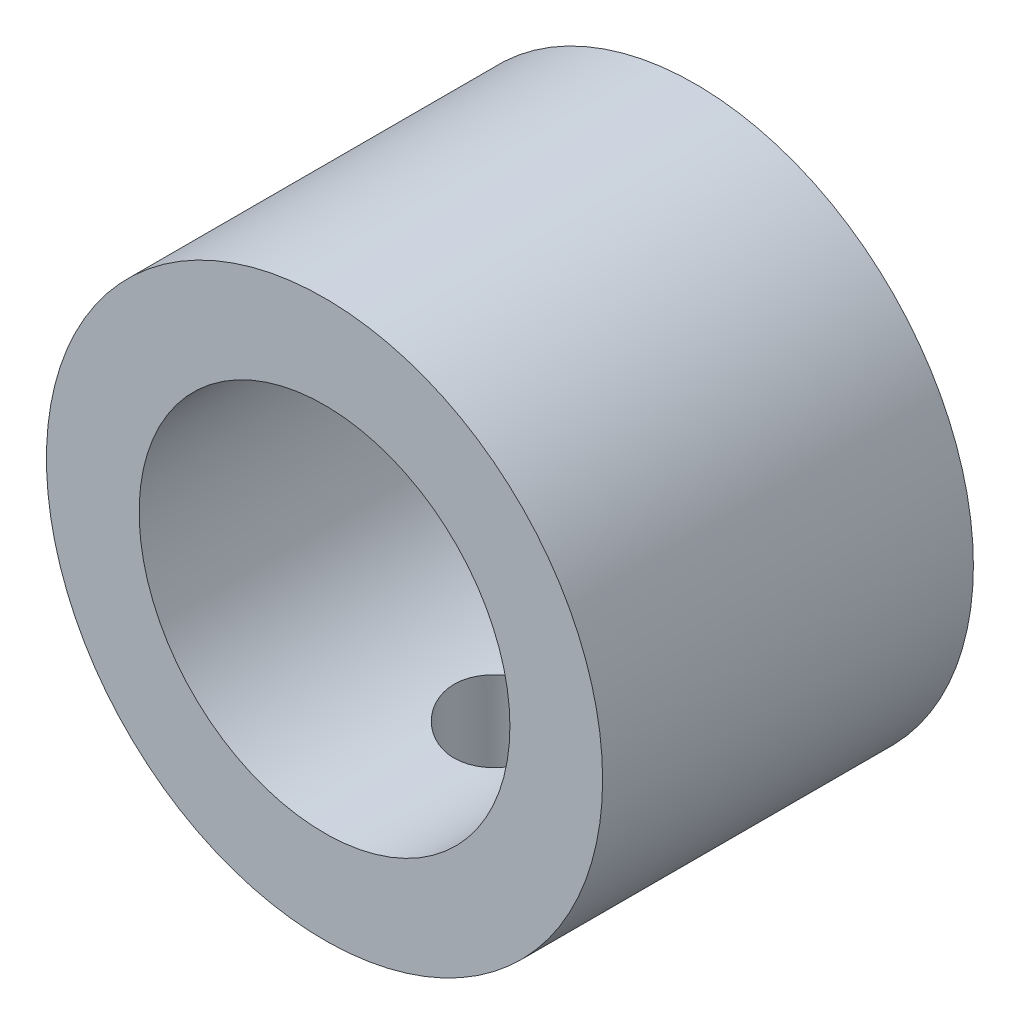
ISO-10303-21;
HEADER;
FILE_DESCRIPTION(('STEP AP214'),'2;1');
FILE_NAME('part.step','',(''),(''),'','','');
FILE_SCHEMA(('AUTOMOTIVE_DESIGN { 1 0 10303 214 1 1 1 1 }'));
ENDSEC;
DATA;
#1=APPLICATION_CONTEXT('core data for automotive mechanical design processes');
#2=APPLICATION_PROTOCOL_DEFINITION('international standard','automotive_design',2000,#1);
#3=PRODUCT_CONTEXT('',#1,'mechanical');
#4=PRODUCT('Part','Part','',(#3));
#5=PRODUCT_RELATED_PRODUCT_CATEGORY('part','',(#4));
#6=PRODUCT_DEFINITION_FORMATION('','',#4);
#7=PRODUCT_DEFINITION_CONTEXT('part definition',#1,'design');
#8=PRODUCT_DEFINITION('design','',#6,#7);
#9=PRODUCT_DEFINITION_SHAPE('','',#8);
#10=(LENGTH_UNIT() NAMED_UNIT(*) SI_UNIT(.MILLI.,.METRE.));
#11=(NAMED_UNIT(*) PLANE_ANGLE_UNIT() SI_UNIT($,.RADIAN.));
#12=(NAMED_UNIT(*) SI_UNIT($,.STERADIAN.) SOLID_ANGLE_UNIT());
#13=UNCERTAINTY_MEASURE_WITH_UNIT(LENGTH_MEASURE(1.E-05),#10,'distance_accuracy_value','');
#14=(GEOMETRIC_REPRESENTATION_CONTEXT(3) GLOBAL_UNCERTAINTY_ASSIGNED_CONTEXT((#13)) GLOBAL_UNIT_ASSIGNED_CONTEXT((#10,
#11,#12)) REPRESENTATION_CONTEXT('',''));
#15=CARTESIAN_POINT('',(0.,0.,0.));
#16=DIRECTION('',(0.,0.,1.));
#17=DIRECTION('',(1.,0.,0.));
#18=AXIS2_PLACEMENT_3D('',#15,#16,#17);
#19=CARTESIAN_POINT('',(0.,0.,5.));
#20=DIRECTION('',(0.,0.,1.));
#21=DIRECTION('',(1.,0.,0.));
#22=AXIS2_PLACEMENT_3D('',#19,#20,#21);
#23=PLANE('',#22);
#24=CARTESIAN_POINT('',(0.,0.,5.));
#25=DIRECTION('',(0.,0.,1.));
#26=DIRECTION('',(1.,0.,0.));
#27=AXIS2_PLACEMENT_3D('',#24,#25,#26);
#28=CIRCLE('',#27,7.5);
#29=CARTESIAN_POINT('',(7.5,0.,5.));
#30=VERTEX_POINT('',#29);
#31=EDGE_CURVE('E10',#30,#30,#28,.T.);
#32=ORIENTED_EDGE('',*,*,#31,.T.);
#33=EDGE_LOOP('',(#32));
#34=FACE_BOUND('',#33,.T.);
#35=CARTESIAN_POINT('',(0.,0.,5.));
#36=DIRECTION('',(0.,0.,1.));
#37=DIRECTION('',(1.,0.,0.));
#38=AXIS2_PLACEMENT_3D('',#35,#36,#37);
#39=CIRCLE('',#38,5.);
#40=CARTESIAN_POINT('',(5.,0.,5.));
#41=VERTEX_POINT('',#40);
#42=EDGE_CURVE('E48',#41,#41,#39,.T.);
#43=ORIENTED_EDGE('',*,*,#42,.F.);
#44=EDGE_LOOP('',(#43));
#45=FACE_BOUND('',#44,.T.);
#46=ADVANCED_FACE('F31',(#34,#45),#23,.T.);
#47=CARTESIAN_POINT('',(0.,0.,-5.));
#48=DIRECTION('',(0.,0.,1.));
#49=DIRECTION('',(1.,0.,0.));
#50=AXIS2_PLACEMENT_3D('',#47,#48,#49);
#51=PLANE('',#50);
#52=CARTESIAN_POINT('',(0.,0.,-5.));
#53=DIRECTION('',(0.,0.,1.));
#54=DIRECTION('',(1.,0.,0.));
#55=AXIS2_PLACEMENT_3D('',#52,#53,#54);
#56=CIRCLE('',#55,7.5);
#57=CARTESIAN_POINT('',(7.5,0.,-5.));
#58=VERTEX_POINT('',#57);
#59=EDGE_CURVE('E43',#58,#58,#56,.T.);
#60=ORIENTED_EDGE('',*,*,#59,.F.);
#61=EDGE_LOOP('',(#60));
#62=FACE_BOUND('',#61,.T.);
#63=CARTESIAN_POINT('',(0.,0.,-5.));
#64=DIRECTION('',(0.,0.,1.));
#65=DIRECTION('',(1.,0.,0.));
#66=AXIS2_PLACEMENT_3D('',#63,#64,#65);
#67=CIRCLE('',#66,5.);
#68=CARTESIAN_POINT('',(5.,0.,-5.));
#69=VERTEX_POINT('',#68);
#70=EDGE_CURVE('E50',#69,#69,#67,.T.);
#71=ORIENTED_EDGE('',*,*,#70,.T.);
#72=EDGE_LOOP('',(#71));
#73=FACE_BOUND('',#72,.T.);
#74=ADVANCED_FACE('F69',(#62,#73),#51,.F.);
#75=CARTESIAN_POINT('',(0.,0.,5.));
#76=DIRECTION('',(0.,0.,-1.));
#77=DIRECTION('',(-1.,0.,0.));
#78=AXIS2_PLACEMENT_3D('',#75,#76,#77);
#79=CYLINDRICAL_SURFACE('',#78,7.5);
#80=CARTESIAN_POINT('',(0.,-7.5,1.5));
#81=CARTESIAN_POINT('',(-0.0833653601889498,-7.49999846371307,1.49999693325248));
#82=CARTESIAN_POINT('',(-0.166769490302284,-7.49859577767346,1.49302673554853));
#83=CARTESIAN_POINT('',(-0.331220261533529,-7.49313548434847,1.46535224982713));
#84=CARTESIAN_POINT('',(-0.412264976312034,-7.48907576790279,1.44463705079774));
#85=CARTESIAN_POINT('',(-0.569595457894969,-7.4787547391743,1.39013808956882));
#86=CARTESIAN_POINT('',(-0.645885701899701,-7.47249553615077,1.35636684473297));
#87=CARTESIAN_POINT('',(-0.791711983296338,-7.45845597052971,1.27675162873306));
#88=CARTESIAN_POINT('',(-0.861248422613718,-7.4506756985356,1.23090837658919));
#89=CARTESIAN_POINT('',(-0.992540215972297,-7.43433247994955,1.12779225856285));
#90=CARTESIAN_POINT('',(-1.05419092673779,-7.42576118256521,1.0703874669132));
#91=CARTESIAN_POINT('',(-1.16705513491204,-7.40886270678882,0.946061375412447));
#92=CARTESIAN_POINT('',(-1.21826781715564,-7.40053554750636,0.879139332997323));
#93=CARTESIAN_POINT('',(-1.30924763002143,-7.38498662718923,0.736925710482187));
#94=CARTESIAN_POINT('',(-1.3489064082988,-7.37777561047419,0.661563534305461));
#95=CARTESIAN_POINT('',(-1.41495849987046,-7.36539402087627,0.505077271493881));
#96=CARTESIAN_POINT('',(-1.44135312365586,-7.36022324642942,0.423953754980482));
#97=CARTESIAN_POINT('',(-1.47978794982724,-7.35259207878307,0.259373454138124));
#98=CARTESIAN_POINT('',(-1.49201174693817,-7.35009705160781,0.175961183786661));
#99=CARTESIAN_POINT('',(-1.50232819158918,-7.34799562590941,0.00823526795348636));
#100=CARTESIAN_POINT('',(-1.50042228407025,-7.34838893201761,-0.0760782844802178));
#101=CARTESIAN_POINT('',(-1.48268185965273,-7.35198826722277,-0.241870182031505));
#102=CARTESIAN_POINT('',(-1.46705781036586,-7.35515179288145,-0.323372108440971));
#103=CARTESIAN_POINT('',(-1.42265682693458,-7.36386819240002,-0.482574114994503));
#104=CARTESIAN_POINT('',(-1.39387926465102,-7.36942118036668,-0.560274013378512));
#105=CARTESIAN_POINT('',(-1.32378717551208,-7.38233427750612,-0.710272892555398));
#106=CARTESIAN_POINT('',(-1.28238922684817,-7.38970634720557,-0.782531819353757));
#107=CARTESIAN_POINT('',(-1.18829036185902,-7.40541928159593,-0.919156274959221));
#108=CARTESIAN_POINT('',(-1.13558814653524,-7.41376025757549,-0.983520895276736));
#109=CARTESIAN_POINT('',(-1.01924990184088,-7.43065531862193,-1.1037441036854));
#110=CARTESIAN_POINT('',(-0.955434241818668,-7.43921053816357,-1.1594288517887));
#111=CARTESIAN_POINT('',(-0.819277536093015,-7.45543273071613,-1.25933076945184));
#112=CARTESIAN_POINT('',(-0.746936381069084,-7.4630996923346,-1.30354779194037));
#113=CARTESIAN_POINT('',(-0.595589080318381,-7.47670035241331,-1.37929126383896));
#114=CARTESIAN_POINT('',(-0.51657272937795,-7.48263133272408,-1.41079784046681));
#115=CARTESIAN_POINT('',(-0.354223464672997,-7.49207113481787,-1.46004071105785));
#116=CARTESIAN_POINT('',(-0.270891075108675,-7.49558025000797,-1.47777867311044));
#117=CARTESIAN_POINT('',(-0.103769108440726,-7.49974007800302,-1.49873468069142));
#118=CARTESIAN_POINT('',(-0.0200104924883644,-7.50043761978705,-1.5021906293104));
#119=CARTESIAN_POINT('',(0.146887401289071,-7.49902577895154,-1.49512521158673));
#120=CARTESIAN_POINT('',(0.23002671366569,-7.49691655412169,-1.48460463097111));
#121=CARTESIAN_POINT('',(0.392558489919811,-7.49015748012026,-1.45008243968407));
#122=CARTESIAN_POINT('',(0.471977922509855,-7.4855306460631,-1.42620289725315));
#123=CARTESIAN_POINT('',(0.625685441249501,-7.47425328091549,-1.36577402601629));
#124=CARTESIAN_POINT('',(0.699973142456309,-7.4676025982134,-1.32922374798476));
#125=CARTESIAN_POINT('',(0.842311760529326,-7.45289867299942,-1.24397626402303));
#126=CARTESIAN_POINT('',(0.910275190128282,-7.44482925655578,-1.19513582844158));
#127=CARTESIAN_POINT('',(1.03712702867881,-7.42822102244824,-1.08688621318908));
#128=CARTESIAN_POINT('',(1.09601446339614,-7.41968215452582,-1.0274759004002));
#129=CARTESIAN_POINT('',(1.20396088616126,-7.40293955335447,-0.898689972163314));
#130=CARTESIAN_POINT('',(1.25285655367298,-7.39474290349956,-0.829176383667994));
#131=CARTESIAN_POINT('',(1.33827813007681,-7.37976287694291,-0.682782957964981));
#132=CARTESIAN_POINT('',(1.37480453388435,-7.37297944370014,-0.605903415639671));
#133=CARTESIAN_POINT('',(1.43422776237294,-7.36165110876574,-0.447347630775677));
#134=CARTESIAN_POINT('',(1.45719524968658,-7.3570946230828,-0.365698738184521));
#135=CARTESIAN_POINT('',(1.48906297744079,-7.35071155188038,-0.199599819763642));
#136=CARTESIAN_POINT('',(1.49796505233767,-7.34888461036667,-0.115150160685979));
#137=CARTESIAN_POINT('',(1.5013813663012,-7.34818724447069,0.0525132968164782));
#138=CARTESIAN_POINT('',(1.49615368210634,-7.34926378783951,0.135721723390514));
#139=CARTESIAN_POINT('',(1.47202845615009,-7.35413360226921,0.30004747485754));
#140=CARTESIAN_POINT('',(1.45313102419395,-7.35792685150754,0.381164816542207));
#141=CARTESIAN_POINT('',(1.40231785274843,-7.36777896328738,0.538841566860818));
#142=CARTESIAN_POINT('',(1.37043376007602,-7.37383231528246,0.615411540753623));
#143=CARTESIAN_POINT('',(1.29458196690241,-7.38752572461255,0.762155581101662));
#144=CARTESIAN_POINT('',(1.25061325316232,-7.39516591498341,0.832329110587706));
#145=CARTESIAN_POINT('',(1.15095887217962,-7.41133440784838,0.965573358225471));
#146=CARTESIAN_POINT('',(1.09508683085277,-7.41987559364549,1.02850314790139));
#147=CARTESIAN_POINT('',(0.973596553519711,-7.43679122807932,1.14417930829376));
#148=CARTESIAN_POINT('',(0.907976080730003,-7.44516563794777,1.19692333547591));
#149=CARTESIAN_POINT('',(0.76802644363237,-7.46090748581957,1.29125196591967));
#150=CARTESIAN_POINT('',(0.693613326644752,-7.46826346828869,1.33271400492004));
#151=CARTESIAN_POINT('',(0.538749541411099,-7.481026876275,1.40247918389489));
#152=CARTESIAN_POINT('',(0.458304391294689,-7.48643605707924,1.43079418429874));
#153=CARTESIAN_POINT('',(0.314732233385669,-7.49364558893056,1.46797792206707));
#154=CARTESIAN_POINT('',(0.252422496020677,-7.49601454737677,1.47996479056164));
#155=CARTESIAN_POINT('',(0.1267492878151,-7.49919231209839,1.49597686853755));
#156=CARTESIAN_POINT('',(0.0633858506229286,-7.50000116809732,1.50000233176465));
#157=CARTESIAN_POINT('',(0.,-7.5,1.5));
#158=B_SPLINE_CURVE_WITH_KNOTS('',3,(#80,#81,#82,#83,#84,#85,#86,#87,#88,#89,#90,#91,#92,#93,
#94,#95,#96,#97,#98,#99,#100,#101,#102,#103,#104,#105,#106,#107,#108,#109,#110,#111,#112,#113,
#114,#115,#116,#117,#118,#119,#120,#121,#122,#123,#124,#125,#126,#127,#128,#129,#130,#131,#132,
#133,#134,#135,#136,#137,#138,#139,#140,#141,#142,#143,#144,#145,#146,#147,#148,#149,#150,#151,
#152,#153,#154,#155,#156,#157),.UNSPECIFIED.,.T.,.F.,(4,2,2,2,2,2,2,2,2,2,2,2,2,2,2,2,2,2,2,2,2,
2,2,2,2,2,2,2,2,2,2,2,2,2,2,2,2,2,4),(0.,0.249864195991888,0.499926976036985,0.749750602875513,
0.999559353346295,1.25239900516828,1.50525839512105,1.76041792508884,2.01555224047796,
2.26734277655381,2.51910756421838,2.76707590509417,3.01505608880594,3.26471235305389,
3.51439732124506,3.76857378737026,4.0227535130973,4.27732912281036,4.53187388547054,
4.78216103514398,5.03243411486801,5.28045680926085,5.52849808824034,5.77957599050038,
6.03068082518895,6.28560942868839,6.540527830852,6.79410571549085,7.04765052495622,
7.29659583851552,7.54553915238913,7.79387941879665,8.042240513728,8.29482114358715,
8.54745981799396,8.80274245013456,9.05779433276278,9.24778162934841,9.43776287056494),.UNSPECIFIED.);
#159=CARTESIAN_POINT('',(0.,-7.5,1.5));
#160=VERTEX_POINT('',#159);
#161=EDGE_CURVE('E55',#160,#160,#158,.T.);
#162=ORIENTED_EDGE('',*,*,#161,.F.);
#163=EDGE_LOOP('',(#162));
#164=FACE_BOUND('',#163,.T.);
#165=ORIENTED_EDGE('',*,*,#31,.F.);
#166=EDGE_LOOP('',(#165));
#167=FACE_BOUND('',#166,.T.);
#168=ORIENTED_EDGE('',*,*,#59,.T.);
#169=EDGE_LOOP('',(#168));
#170=FACE_BOUND('',#169,.T.);
#171=ADVANCED_FACE('F33',(#164,#167,#170),#79,.T.);
#172=CARTESIAN_POINT('',(0.,0.,5.));
#173=DIRECTION('',(0.,0.,-1.));
#174=DIRECTION('',(-1.,0.,0.));
#175=AXIS2_PLACEMENT_3D('',#172,#173,#174);
#176=CYLINDRICAL_SURFACE('',#175,5.);
#177=CARTESIAN_POINT('',(0.,-5.,1.5));
#178=CARTESIAN_POINT('',(0.0822886127533,-4.9999992925055,1.49999900251511));
#179=CARTESIAN_POINT('',(0.164587318351529,-4.99794915693954,1.49320613637603));
#180=CARTESIAN_POINT('',(0.326788125304881,-4.98997105593692,1.4662786457779));
#181=CARTESIAN_POINT('',(0.40668950441142,-4.98404193389692,1.44614004197666));
#182=CARTESIAN_POINT('',(0.561732707754527,-4.96895552501837,1.39325398308974));
#183=CARTESIAN_POINT('',(0.636881364395373,-4.95980300250426,1.36052513038106));
#184=CARTESIAN_POINT('',(0.780624181053131,-4.93922109237646,1.28346390694416));
#185=CARTESIAN_POINT('',(0.849217467469669,-4.92779140192067,1.23912999260458));
#186=CARTESIAN_POINT('',(0.979871797183745,-4.90350737192774,1.13877599252733));
#187=CARTESIAN_POINT('',(1.04171807124434,-4.89062383657037,1.08248337411409));
#188=CARTESIAN_POINT('',(1.15524920923324,-4.86505834210443,0.960390770089816));
#189=CARTESIAN_POINT('',(1.20693236327441,-4.85237641724502,0.89458918787504));
#190=CARTESIAN_POINT('',(1.29980037723708,-4.82834113993773,0.753529246962388));
#191=CARTESIAN_POINT('',(1.34072309022213,-4.81702406663875,0.678091539009262));
#192=CARTESIAN_POINT('',(1.4092139477476,-4.79743620394031,0.521010745769707));
#193=CARTESIAN_POINT('',(1.43678529919973,-4.78916468313311,0.439369156072024));
#194=CARTESIAN_POINT('',(1.47701633682652,-4.77690870838435,0.27460973386954));
#195=CARTESIAN_POINT('',(1.49007196234677,-4.77281069324534,0.191597256136056));
#196=CARTESIAN_POINT('',(1.50213730614672,-4.76902789749768,0.0244668437832339));
#197=CARTESIAN_POINT('',(1.50115042761078,-4.76934204760572,-0.0596508180590882));
#198=CARTESIAN_POINT('',(1.48546977199812,-4.77424744067778,-0.223383908608484));
#199=CARTESIAN_POINT('',(1.47127205262685,-4.77868388599141,-0.303052250362239));
#200=CARTESIAN_POINT('',(1.43037420427056,-4.79108356228625,-0.458819786273461));
#201=CARTESIAN_POINT('',(1.40367284141641,-4.79904714132351,-0.534918627374334));
#202=CARTESIAN_POINT('',(1.33816026653682,-4.81772733074973,-0.68260034966074));
#203=CARTESIAN_POINT('',(1.29918816934642,-4.82848016115953,-0.754107083955263));
#204=CARTESIAN_POINT('',(1.21035222588683,-4.85150987000065,-0.889732022010193));
#205=CARTESIAN_POINT('',(1.16048574002588,-4.86378711746991,-0.953848429413779));
#206=CARTESIAN_POINT('',(1.04881290765546,-4.88911011297938,-1.07568619076202));
#207=CARTESIAN_POINT('',(0.986594907466971,-4.90216654310498,-1.13302866402967));
#208=CARTESIAN_POINT('',(0.853263259313966,-4.92712244063259,-1.23655398406425));
#209=CARTESIAN_POINT('',(0.782149051860887,-4.93902183518411,-1.28273612841443));
#210=CARTESIAN_POINT('',(0.632355038342802,-4.96043160069471,-1.36285992246473));
#211=CARTESIAN_POINT('',(0.553627749747949,-4.96992543668315,-1.39671751624986));
#212=CARTESIAN_POINT('',(0.391245415603518,-4.98533521832222,-1.45059959009963));
#213=CARTESIAN_POINT('',(0.307591751589581,-4.99125216187,-1.47062792853249));
#214=CARTESIAN_POINT('',(0.140952242668331,-4.99868364643539,-1.49565217789939));
#215=CARTESIAN_POINT('',(0.0580500976011859,-5.00034850417791,-1.50116158580161));
#216=CARTESIAN_POINT('',(-0.107499605823384,-4.9995292324176,-1.49843084428792));
#217=CARTESIAN_POINT('',(-0.190147196690782,-4.99704565677757,-1.49019253034856));
#218=CARTESIAN_POINT('',(-0.350903605309698,-4.98830696987163,-1.4606153888885));
#219=CARTESIAN_POINT('',(-0.42907277261417,-4.98213829799417,-1.43957661241913));
#220=CARTESIAN_POINT('',(-0.580754638954523,-4.96674347841533,-1.3853567672218));
#221=CARTESIAN_POINT('',(-0.654266777025584,-4.95751696321085,-1.35217423896214));
#222=CARTESIAN_POINT('',(-0.796437189461053,-4.93669654351325,-1.27374683451887));
#223=CARTESIAN_POINT('',(-0.86494382619967,-4.92505280829675,-1.22824065905203));
#224=CARTESIAN_POINT('',(-0.993523307980147,-4.90073468764318,-1.12677524594719));
#225=CARTESIAN_POINT('',(-1.05359403235594,-4.8880600443108,-1.07081338811233));
#226=CARTESIAN_POINT('',(-1.16585744551027,-4.86253171869138,-0.947612691630654));
#227=CARTESIAN_POINT('',(-1.21768481231504,-4.84968825033268,-0.880038124228263));
#228=CARTESIAN_POINT('',(-1.30928995072154,-4.82576515238464,-0.736872060986467));
#229=CARTESIAN_POINT('',(-1.34906803829472,-4.81468547654652,-0.661280775441785));
#230=CARTESIAN_POINT('',(-1.41517347127168,-4.79567189615055,-0.504467508745311));
#231=CARTESIAN_POINT('',(-1.4415634693705,-4.78772337843827,-0.423273813463408));
#232=CARTESIAN_POINT('',(-1.48021730815114,-4.77591594362795,-0.257312031068521));
#233=CARTESIAN_POINT('',(-1.49248598978779,-4.77205562508301,-0.17254517921233));
#234=CARTESIAN_POINT('',(-1.50221984485059,-4.76899972496087,-0.00563848162377096));
#235=CARTESIAN_POINT('',(-1.5002805530849,-4.76961647442755,0.0764636510175875));
#236=CARTESIAN_POINT('',(-1.48307505444813,-4.77499401288295,0.239114103372802));
#237=CARTESIAN_POINT('',(-1.46780938124716,-4.77975463592552,0.319662485176355));
#238=CARTESIAN_POINT('',(-1.42476888804136,-4.79275763670386,0.475945399142853));
#239=CARTESIAN_POINT('',(-1.39715175507068,-4.80095604545965,0.551727287361695));
#240=CARTESIAN_POINT('',(-1.33031507121129,-4.81990278909137,0.697642438817725));
#241=CARTESIAN_POINT('',(-1.29109329962876,-4.83065161194312,0.767774617640758));
#242=CARTESIAN_POINT('',(-1.20048763805072,-4.85397676425833,0.903163116527114));
#243=CARTESIAN_POINT('',(-1.14871276092994,-4.86660540163798,0.968148761260413));
#244=CARTESIAN_POINT('',(-1.03517434629782,-4.89201320450026,1.08870249830786));
#245=CARTESIAN_POINT('',(-0.9734082171345,-4.90479240823906,1.14426813946776));
#246=CARTESIAN_POINT('',(-0.839465762183247,-4.92950936570649,1.24602341229503));
#247=CARTESIAN_POINT('',(-0.767037885790606,-4.94141159765674,1.29189144685549));
#248=CARTESIAN_POINT('',(-0.615141373983528,-4.96260680455813,1.37073516990403));
#249=CARTESIAN_POINT('',(-0.535676052998953,-4.97190099931067,1.40371688827451));
#250=CARTESIAN_POINT('',(-0.38075771265528,-4.98602174969301,1.45289527565275));
#251=CARTESIAN_POINT('',(-0.305786961954233,-4.99122027381068,1.47051167288325));
#252=CARTESIAN_POINT('',(-0.153880195230779,-4.99820944494493,1.49406352524158));
#253=CARTESIAN_POINT('',(-0.0769445098581395,-5.0000006615474,1.50000093270482));
#254=CARTESIAN_POINT('',(0.,-5.,1.5));
#255=B_SPLINE_CURVE_WITH_KNOTS('',3,(#177,#178,#179,#180,#181,#182,#183,#184,#185,#186,#187,
#188,#189,#190,#191,#192,#193,#194,#195,#196,#197,#198,#199,#200,#201,#202,#203,#204,#205,#206,
#207,#208,#209,#210,#211,#212,#213,#214,#215,#216,#217,#218,#219,#220,#221,#222,#223,#224,#225,
#226,#227,#228,#229,#230,#231,#232,#233,#234,#235,#236,#237,#238,#239,#240,#241,#242,#243,#244,
#245,#246,#247,#248,#249,#250,#251,#252,#253,#254),.UNSPECIFIED.,.T.,.F.,(4,2,2,2,2,2,2,2,2,2,2,
2,2,2,2,2,2,2,2,2,2,2,2,2,2,2,2,2,2,2,2,2,2,2,2,2,2,2,4),(0.,0.246583203612611,0.493239964846,
0.739533676300874,0.985860164412702,1.23855602948191,1.49129437288633,1.74971481004109,
2.00807314543224,2.25919689356599,2.51025978319089,2.75226016697676,2.99428443658001,
3.2396242644712,3.48502360158556,3.74067104048167,3.99633456531072,4.25371046881689,
4.51101453528808,4.75908809438545,5.00712853550327,5.24956746682327,5.49203554593729,
5.74011305702908,5.98825282000191,6.24540400322819,6.5025484425268,6.75847814951252,
7.01432009460283,7.25950155466943,7.504673196616,7.74680040402721,7.98897397553107,
8.23996925679931,8.49102974897502,8.74942996156671,9.00770911595235,9.23831691930459,
9.46888616948874),.UNSPECIFIED.);
#256=CARTESIAN_POINT('',(0.,-5.,1.5));
#257=VERTEX_POINT('',#256);
#258=EDGE_CURVE('E35',#257,#257,#255,.T.);
#259=ORIENTED_EDGE('',*,*,#258,.F.);
#260=EDGE_LOOP('',(#259));
#261=FACE_BOUND('',#260,.T.);
#262=ORIENTED_EDGE('',*,*,#42,.T.);
#263=EDGE_LOOP('',(#262));
#264=FACE_BOUND('',#263,.T.);
#265=ORIENTED_EDGE('',*,*,#70,.F.);
#266=EDGE_LOOP('',(#265));
#267=FACE_BOUND('',#266,.T.);
#268=ADVANCED_FACE('F63',(#261,#264,#267),#176,.F.);
#269=CARTESIAN_POINT('',(0.,-7.501,0.));
#270=DIRECTION('',(0.,1.,0.));
#271=DIRECTION('',(0.,0.,1.));
#272=AXIS2_PLACEMENT_3D('',#269,#270,#271);
#273=CYLINDRICAL_SURFACE('',#272,1.5);
#274=ORIENTED_EDGE('',*,*,#258,.T.);
#275=EDGE_LOOP('',(#274));
#276=FACE_BOUND('',#275,.T.);
#277=ORIENTED_EDGE('',*,*,#161,.T.);
#278=EDGE_LOOP('',(#277));
#279=FACE_BOUND('',#278,.T.);
#280=ADVANCED_FACE('F60',(#276,#279),#273,.F.);
#281=CLOSED_SHELL('',(#46,#74,#171,#268,#280));
#282=MANIFOLD_SOLID_BREP('B2',#281);
#283=ADVANCED_BREP_SHAPE_REPRESENTATION('',(#18,#282),#14);
#284=SHAPE_DEFINITION_REPRESENTATION(#9,#283);
ENDSEC;
END-ISO-10303-21;
